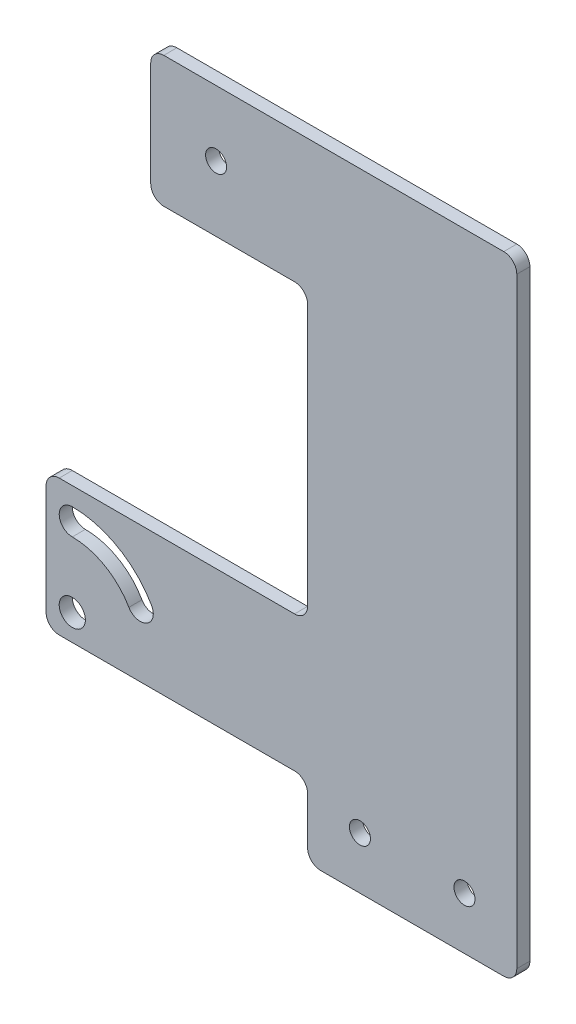
ISO-10303-21;
HEADER;
FILE_DESCRIPTION(('STEP AP214'),'2;1');
FILE_NAME('part.step','',(''),(''),'','','');
FILE_SCHEMA(('AUTOMOTIVE_DESIGN { 1 0 10303 214 1 1 1 1 }'));
ENDSEC;
DATA;
#1=APPLICATION_CONTEXT('core data for automotive mechanical design processes');
#2=APPLICATION_PROTOCOL_DEFINITION('international standard','automotive_design',2000,#1);
#3=PRODUCT_CONTEXT('',#1,'mechanical');
#4=PRODUCT('Part','Part','',(#3));
#5=PRODUCT_RELATED_PRODUCT_CATEGORY('part','',(#4));
#6=PRODUCT_DEFINITION_FORMATION('','',#4);
#7=PRODUCT_DEFINITION_CONTEXT('part definition',#1,'design');
#8=PRODUCT_DEFINITION('design','',#6,#7);
#9=PRODUCT_DEFINITION_SHAPE('','',#8);
#10=(LENGTH_UNIT() NAMED_UNIT(*) SI_UNIT(.MILLI.,.METRE.));
#11=(NAMED_UNIT(*) PLANE_ANGLE_UNIT() SI_UNIT($,.RADIAN.));
#12=(NAMED_UNIT(*) SI_UNIT($,.STERADIAN.) SOLID_ANGLE_UNIT());
#13=UNCERTAINTY_MEASURE_WITH_UNIT(LENGTH_MEASURE(1.E-05),#10,'distance_accuracy_value','');
#14=(GEOMETRIC_REPRESENTATION_CONTEXT(3) GLOBAL_UNCERTAINTY_ASSIGNED_CONTEXT((#13)) GLOBAL_UNIT_ASSIGNED_CONTEXT((#10,
#11,#12)) REPRESENTATION_CONTEXT('',''));
#15=CARTESIAN_POINT('',(0.,0.,0.));
#16=DIRECTION('',(0.,0.,1.));
#17=DIRECTION('',(1.,0.,0.));
#18=AXIS2_PLACEMENT_3D('',#15,#16,#17);
#19=CARTESIAN_POINT('',(0.,50.8,3.175));
#20=DIRECTION('',(0.,1.,0.));
#21=DIRECTION('',(0.,0.,1.));
#22=AXIS2_PLACEMENT_3D('',#19,#20,#21);
#23=PLANE('',#22);
#24=DIRECTION('',(1.,0.,0.));
#25=VECTOR('',#24,1.);
#26=CARTESIAN_POINT('',(0.,50.8,0.));
#27=LINE('',#26,#25);
#28=CARTESIAN_POINT('',(-60.325,50.8,0.));
#29=VERTEX_POINT('',#28);
#30=CARTESIAN_POINT('',(-3.175,50.8,0.));
#31=VERTEX_POINT('',#30);
#32=EDGE_CURVE('E251',#29,#31,#27,.T.);
#33=ORIENTED_EDGE('',*,*,#32,.F.);
#34=DIRECTION('',(0.,0.,-1.));
#35=VECTOR('',#34,1.);
#36=CARTESIAN_POINT('',(-60.325,50.8,3.175));
#37=LINE('',#36,#35);
#38=CARTESIAN_POINT('',(-60.325,50.8,3.175));
#39=VERTEX_POINT('',#38);
#40=EDGE_CURVE('E339',#29,#39,#37,.F.);
#41=ORIENTED_EDGE('',*,*,#40,.T.);
#42=DIRECTION('',(1.,0.,0.));
#43=VECTOR('',#42,1.);
#44=CARTESIAN_POINT('',(0.,50.8,3.175));
#45=LINE('',#44,#43);
#46=CARTESIAN_POINT('',(-3.175,50.8,3.175));
#47=VERTEX_POINT('',#46);
#48=EDGE_CURVE('E414',#39,#47,#45,.T.);
#49=ORIENTED_EDGE('',*,*,#48,.T.);
#50=DIRECTION('',(0.,0.,-1.));
#51=VECTOR('',#50,1.);
#52=CARTESIAN_POINT('',(-3.175,50.8,0.));
#53=LINE('',#52,#51);
#54=EDGE_CURVE('E336',#47,#31,#53,.T.);
#55=ORIENTED_EDGE('',*,*,#54,.T.);
#56=EDGE_LOOP('',(#33,#41,#49,#55));
#57=FACE_BOUND('',#56,.T.);
#58=ADVANCED_FACE('F39',(#57),#23,.T.);
#59=CARTESIAN_POINT('',(-57.15,43.18,3.175));
#60=DIRECTION('',(0.,0.,-1.));
#61=DIRECTION('',(-1.,0.,0.));
#62=AXIS2_PLACEMENT_3D('',#59,#60,#61);
#63=CYLINDRICAL_SURFACE('',#62,3.17500000000001);
#64=CARTESIAN_POINT('',(-57.15,43.18,0.));
#65=DIRECTION('',(0.,0.,1.));
#66=DIRECTION('',(1.,0.,0.));
#67=AXIS2_PLACEMENT_3D('',#64,#65,#66);
#68=CIRCLE('',#67,3.17500000000001);
#69=CARTESIAN_POINT('',(-57.15,46.355,0.));
#70=VERTEX_POINT('',#69);
#71=CARTESIAN_POINT('',(-57.15,40.005,0.));
#72=VERTEX_POINT('',#71);
#73=EDGE_CURVE('E207',#70,#72,#68,.T.);
#74=ORIENTED_EDGE('',*,*,#73,.F.);
#75=DIRECTION('',(0.,0.,-1.));
#76=VECTOR('',#75,1.);
#77=CARTESIAN_POINT('',(-57.15,46.355,3.175));
#78=LINE('',#77,#76);
#79=CARTESIAN_POINT('',(-57.15,46.355,3.175));
#80=VERTEX_POINT('',#79);
#81=EDGE_CURVE('E202',#80,#70,#78,.T.);
#82=ORIENTED_EDGE('',*,*,#81,.F.);
#83=CARTESIAN_POINT('',(-57.15,43.18,3.175));
#84=DIRECTION('',(0.,0.,1.));
#85=DIRECTION('',(1.,0.,0.));
#86=AXIS2_PLACEMENT_3D('',#83,#84,#85);
#87=CIRCLE('',#86,3.17500000000001);
#88=CARTESIAN_POINT('',(-57.15,40.005,3.175));
#89=VERTEX_POINT('',#88);
#90=EDGE_CURVE('E205',#80,#89,#87,.T.);
#91=ORIENTED_EDGE('',*,*,#90,.T.);
#92=DIRECTION('',(0.,0.,-1.));
#93=VECTOR('',#92,1.);
#94=CARTESIAN_POINT('',(-57.15,40.005,3.175));
#95=LINE('',#94,#93);
#96=EDGE_CURVE('E237',#89,#72,#95,.T.);
#97=ORIENTED_EDGE('',*,*,#96,.T.);
#98=EDGE_LOOP('',(#74,#82,#91,#97));
#99=FACE_BOUND('',#98,.T.);
#100=ADVANCED_FACE('F204',(#99),#63,.F.);
#101=CARTESIAN_POINT('',(-57.15,24.13,3.175));
#102=DIRECTION('',(0.,0.,-1.));
#103=DIRECTION('',(-1.,0.,0.));
#104=AXIS2_PLACEMENT_3D('',#101,#102,#103);
#105=CYLINDRICAL_SURFACE('',#104,22.225);
#106=CARTESIAN_POINT('',(-57.15,24.13,0.));
#107=DIRECTION('',(0.,0.,1.));
#108=DIRECTION('',(1.,0.,0.));
#109=AXIS2_PLACEMENT_3D('',#106,#107,#108);
#110=CIRCLE('',#109,22.225);
#111=CARTESIAN_POINT('',(-37.9025854008909,35.2425000000001,0.));
#112=VERTEX_POINT('',#111);
#113=EDGE_CURVE('E264',#112,#70,#110,.T.);
#114=ORIENTED_EDGE('',*,*,#113,.F.);
#115=DIRECTION('',(0.,0.,-1.));
#116=VECTOR('',#115,1.);
#117=CARTESIAN_POINT('',(-37.9025854008909,35.2425000000001,3.175));
#118=LINE('',#117,#116);
#119=CARTESIAN_POINT('',(-37.9025854008909,35.2425000000001,3.175));
#120=VERTEX_POINT('',#119);
#121=EDGE_CURVE('E213',#120,#112,#118,.T.);
#122=ORIENTED_EDGE('',*,*,#121,.F.);
#123=CARTESIAN_POINT('',(-57.15,24.13,3.175));
#124=DIRECTION('',(0.,0.,1.));
#125=DIRECTION('',(1.,0.,0.));
#126=AXIS2_PLACEMENT_3D('',#123,#124,#125);
#127=CIRCLE('',#126,22.225);
#128=EDGE_CURVE('E220',#120,#80,#127,.T.);
#129=ORIENTED_EDGE('',*,*,#128,.T.);
#130=ORIENTED_EDGE('',*,*,#81,.T.);
#131=EDGE_LOOP('',(#114,#122,#129,#130));
#132=FACE_BOUND('',#131,.T.);
#133=ADVANCED_FACE('F227',(#132),#105,.F.);
#134=CARTESIAN_POINT('',(-40.6522160579065,33.6550000000001,3.175));
#135=DIRECTION('',(0.,0.,-1.));
#136=DIRECTION('',(-1.,0.,0.));
#137=AXIS2_PLACEMENT_3D('',#134,#135,#136);
#138=CYLINDRICAL_SURFACE('',#137,3.175);
#139=CARTESIAN_POINT('',(-40.6522160579065,33.6550000000001,0.));
#140=DIRECTION('',(0.,0.,1.));
#141=DIRECTION('',(1.,0.,0.));
#142=AXIS2_PLACEMENT_3D('',#139,#140,#141);
#143=CIRCLE('',#142,3.175);
#144=CARTESIAN_POINT('',(-43.4018467149221,32.0675000000001,0.));
#145=VERTEX_POINT('',#144);
#146=EDGE_CURVE('E266',#145,#112,#143,.T.);
#147=ORIENTED_EDGE('',*,*,#146,.F.);
#148=DIRECTION('',(0.,0.,-1.));
#149=VECTOR('',#148,1.);
#150=CARTESIAN_POINT('',(-43.4018467149221,32.0675000000001,3.175));
#151=LINE('',#150,#149);
#152=CARTESIAN_POINT('',(-43.4018467149221,32.0675000000001,3.175));
#153=VERTEX_POINT('',#152);
#154=EDGE_CURVE('E277',#153,#145,#151,.T.);
#155=ORIENTED_EDGE('',*,*,#154,.F.);
#156=CARTESIAN_POINT('',(-40.6522160579065,33.6550000000001,3.175));
#157=DIRECTION('',(0.,0.,1.));
#158=DIRECTION('',(1.,0.,0.));
#159=AXIS2_PLACEMENT_3D('',#156,#157,#158);
#160=CIRCLE('',#159,3.175);
#161=EDGE_CURVE('E228',#153,#120,#160,.T.);
#162=ORIENTED_EDGE('',*,*,#161,.T.);
#163=ORIENTED_EDGE('',*,*,#121,.T.);
#164=EDGE_LOOP('',(#147,#155,#162,#163));
#165=FACE_BOUND('',#164,.T.);
#166=ADVANCED_FACE('F476',(#165),#138,.F.);
#167=CARTESIAN_POINT('',(0.,0.,3.175));
#168=DIRECTION('',(0.,1.,0.));
#169=DIRECTION('',(0.,0.,1.));
#170=AXIS2_PLACEMENT_3D('',#167,#168,#169);
#171=PLANE('',#170);
#172=DIRECTION('',(1.,0.,0.));
#173=VECTOR('',#172,1.);
#174=CARTESIAN_POINT('',(0.,0.,0.));
#175=LINE('',#174,#173);
#176=CARTESIAN_POINT('',(3.175,0.,0.));
#177=VERTEX_POINT('',#176);
#178=CARTESIAN_POINT('',(47.625,0.,0.));
#179=VERTEX_POINT('',#178);
#180=EDGE_CURVE('E245',#177,#179,#175,.T.);
#181=ORIENTED_EDGE('',*,*,#180,.T.);
#182=DIRECTION('',(0.,0.,-1.));
#183=VECTOR('',#182,1.);
#184=CARTESIAN_POINT('',(47.625,0.,3.175));
#185=LINE('',#184,#183);
#186=CARTESIAN_POINT('',(47.625,0.,3.175));
#187=VERTEX_POINT('',#186);
#188=EDGE_CURVE('E320',#179,#187,#185,.F.);
#189=ORIENTED_EDGE('',*,*,#188,.T.);
#190=DIRECTION('',(1.,0.,0.));
#191=VECTOR('',#190,1.);
#192=CARTESIAN_POINT('',(0.,0.,3.175));
#193=LINE('',#192,#191);
#194=CARTESIAN_POINT('',(3.175,0.,3.175));
#195=VERTEX_POINT('',#194);
#196=EDGE_CURVE('E409',#195,#187,#193,.T.);
#197=ORIENTED_EDGE('',*,*,#196,.F.);
#198=DIRECTION('',(0.,0.,-1.));
#199=VECTOR('',#198,1.);
#200=CARTESIAN_POINT('',(3.175,0.,0.));
#201=LINE('',#200,#199);
#202=EDGE_CURVE('E317',#195,#177,#201,.T.);
#203=ORIENTED_EDGE('',*,*,#202,.T.);
#204=EDGE_LOOP('',(#181,#189,#197,#203));
#205=FACE_BOUND('',#204,.T.);
#206=ADVANCED_FACE('F472',(#205),#171,.F.);
#207=CARTESIAN_POINT('',(50.8,0.,3.175));
#208=DIRECTION('',(-1.,0.,0.));
#209=DIRECTION('',(0.,0.,1.));
#210=AXIS2_PLACEMENT_3D('',#207,#208,#209);
#211=PLANE('',#210);
#212=DIRECTION('',(0.,1.,0.));
#213=VECTOR('',#212,1.);
#214=CARTESIAN_POINT('',(50.8,0.,0.));
#215=LINE('',#214,#213);
#216=CARTESIAN_POINT('',(50.8,3.175,0.));
#217=VERTEX_POINT('',#216);
#218=CARTESIAN_POINT('',(50.8,149.225,0.));
#219=VERTEX_POINT('',#218);
#220=EDGE_CURVE('E248',#217,#219,#215,.T.);
#221=ORIENTED_EDGE('',*,*,#220,.T.);
#222=DIRECTION('',(0.,0.,-1.));
#223=VECTOR('',#222,1.);
#224=CARTESIAN_POINT('',(50.8,149.225,3.175));
#225=LINE('',#224,#223);
#226=CARTESIAN_POINT('',(50.8,149.225,3.175));
#227=VERTEX_POINT('',#226);
#228=EDGE_CURVE('E301',#219,#227,#225,.F.);
#229=ORIENTED_EDGE('',*,*,#228,.T.);
#230=DIRECTION('',(0.,1.,0.));
#231=VECTOR('',#230,1.);
#232=CARTESIAN_POINT('',(50.8,0.,3.175));
#233=LINE('',#232,#231);
#234=CARTESIAN_POINT('',(50.8,3.175,3.175));
#235=VERTEX_POINT('',#234);
#236=EDGE_CURVE('E412',#235,#227,#233,.T.);
#237=ORIENTED_EDGE('',*,*,#236,.F.);
#238=DIRECTION('',(0.,0.,-1.));
#239=VECTOR('',#238,1.);
#240=CARTESIAN_POINT('',(50.8,3.175,3.175));
#241=LINE('',#240,#239);
#242=EDGE_CURVE('E298',#235,#217,#241,.T.);
#243=ORIENTED_EDGE('',*,*,#242,.T.);
#244=EDGE_LOOP('',(#221,#229,#237,#243));
#245=FACE_BOUND('',#244,.T.);
#246=ADVANCED_FACE('F469',(#245),#211,.F.);
#247=CARTESIAN_POINT('',(-63.5,0.,3.175));
#248=DIRECTION('',(1.,0.,0.));
#249=DIRECTION('',(0.,1.,0.));
#250=AXIS2_PLACEMENT_3D('',#247,#248,#249);
#251=PLANE('',#250);
#252=DIRECTION('',(0.,-1.,0.));
#253=VECTOR('',#252,1.);
#254=CARTESIAN_POINT('',(-63.5,0.,0.));
#255=LINE('',#254,#253);
#256=CARTESIAN_POINT('',(-63.5,47.625,0.));
#257=VERTEX_POINT('',#256);
#258=CARTESIAN_POINT('',(-63.5,20.955,0.));
#259=VERTEX_POINT('',#258);
#260=EDGE_CURVE('E254',#257,#259,#255,.T.);
#261=ORIENTED_EDGE('',*,*,#260,.T.);
#262=DIRECTION('',(0.,0.,-1.));
#263=VECTOR('',#262,1.);
#264=CARTESIAN_POINT('',(-63.5,20.955,3.175));
#265=LINE('',#264,#263);
#266=CARTESIAN_POINT('',(-63.5,20.955,3.175));
#267=VERTEX_POINT('',#266);
#268=EDGE_CURVE('E334',#259,#267,#265,.F.);
#269=ORIENTED_EDGE('',*,*,#268,.T.);
#270=DIRECTION('',(0.,-1.,0.));
#271=VECTOR('',#270,1.);
#272=CARTESIAN_POINT('',(-63.5,0.,3.175));
#273=LINE('',#272,#271);
#274=CARTESIAN_POINT('',(-63.5,47.625,3.175));
#275=VERTEX_POINT('',#274);
#276=EDGE_CURVE('E417',#275,#267,#273,.T.);
#277=ORIENTED_EDGE('',*,*,#276,.F.);
#278=DIRECTION('',(0.,0.,-1.));
#279=VECTOR('',#278,1.);
#280=CARTESIAN_POINT('',(-63.5,47.625,0.));
#281=LINE('',#280,#279);
#282=EDGE_CURVE('E331',#275,#257,#281,.T.);
#283=ORIENTED_EDGE('',*,*,#282,.T.);
#284=EDGE_LOOP('',(#261,#269,#277,#283));
#285=FACE_BOUND('',#284,.T.);
#286=ADVANCED_FACE('F438',(#285),#251,.F.);
#287=CARTESIAN_POINT('',(0.,17.78,3.175));
#288=DIRECTION('',(0.,1.,0.));
#289=DIRECTION('',(0.,0.,1.));
#290=AXIS2_PLACEMENT_3D('',#287,#288,#289);
#291=PLANE('',#290);
#292=DIRECTION('',(1.,0.,0.));
#293=VECTOR('',#292,1.);
#294=CARTESIAN_POINT('',(0.,17.78,0.));
#295=LINE('',#294,#293);
#296=CARTESIAN_POINT('',(-60.325,17.78,0.));
#297=VERTEX_POINT('',#296);
#298=CARTESIAN_POINT('',(-3.175,17.78,0.));
#299=VERTEX_POINT('',#298);
#300=EDGE_CURVE('E257',#297,#299,#295,.T.);
#301=ORIENTED_EDGE('',*,*,#300,.T.);
#302=DIRECTION('',(0.,0.,-1.));
#303=VECTOR('',#302,1.);
#304=CARTESIAN_POINT('',(-3.175,17.78,3.175));
#305=LINE('',#304,#303);
#306=CARTESIAN_POINT('',(-3.175,17.78,3.175));
#307=VERTEX_POINT('',#306);
#308=EDGE_CURVE('E329',#299,#307,#305,.F.);
#309=ORIENTED_EDGE('',*,*,#308,.T.);
#310=DIRECTION('',(1.,0.,0.));
#311=VECTOR('',#310,1.);
#312=CARTESIAN_POINT('',(0.,17.78,3.175));
#313=LINE('',#312,#311);
#314=CARTESIAN_POINT('',(-60.325,17.78,3.175));
#315=VERTEX_POINT('',#314);
#316=EDGE_CURVE('E420',#315,#307,#313,.T.);
#317=ORIENTED_EDGE('',*,*,#316,.F.);
#318=DIRECTION('',(0.,0.,-1.));
#319=VECTOR('',#318,1.);
#320=CARTESIAN_POINT('',(-60.325,17.78,3.175));
#321=LINE('',#320,#319);
#322=EDGE_CURVE('E326',#315,#297,#321,.T.);
#323=ORIENTED_EDGE('',*,*,#322,.T.);
#324=EDGE_LOOP('',(#301,#309,#317,#323));
#325=FACE_BOUND('',#324,.T.);
#326=ADVANCED_FACE('F429',(#325),#291,.F.);
#327=CARTESIAN_POINT('',(-57.15,24.13,3.175));
#328=DIRECTION('',(0.,0.,-1.));
#329=DIRECTION('',(-1.,0.,0.));
#330=AXIS2_PLACEMENT_3D('',#327,#328,#329);
#331=CYLINDRICAL_SURFACE('',#330,15.875);
#332=CARTESIAN_POINT('',(-57.15,24.13,0.));
#333=DIRECTION('',(0.,0.,1.));
#334=DIRECTION('',(1.,0.,0.));
#335=AXIS2_PLACEMENT_3D('',#332,#333,#334);
#336=CIRCLE('',#335,15.875);
#337=EDGE_CURVE('E269',#145,#72,#336,.T.);
#338=ORIENTED_EDGE('',*,*,#337,.T.);
#339=ORIENTED_EDGE('',*,*,#96,.F.);
#340=CARTESIAN_POINT('',(-57.15,24.13,3.175));
#341=DIRECTION('',(0.,0.,1.));
#342=DIRECTION('',(1.,0.,0.));
#343=AXIS2_PLACEMENT_3D('',#340,#341,#342);
#344=CIRCLE('',#343,15.875);
#345=EDGE_CURVE('E223',#153,#89,#344,.T.);
#346=ORIENTED_EDGE('',*,*,#345,.F.);
#347=ORIENTED_EDGE('',*,*,#154,.T.);
#348=EDGE_LOOP('',(#338,#339,#346,#347));
#349=FACE_BOUND('',#348,.T.);
#350=ADVANCED_FACE('F589',(#349),#331,.T.);
#351=CARTESIAN_POINT('',(0.,0.,3.175));
#352=DIRECTION('',(-1.,0.,0.));
#353=DIRECTION('',(0.,0.,1.));
#354=AXIS2_PLACEMENT_3D('',#351,#352,#353);
#355=PLANE('',#354);
#356=DIRECTION('',(0.,1.,0.));
#357=VECTOR('',#356,1.);
#358=CARTESIAN_POINT('',(0.,0.,0.));
#359=LINE('',#358,#357);
#360=CARTESIAN_POINT('',(0.,3.175,0.));
#361=VERTEX_POINT('',#360);
#362=CARTESIAN_POINT('',(0.,14.605,0.));
#363=VERTEX_POINT('',#362);
#364=EDGE_CURVE('E260',#361,#363,#359,.T.);
#365=ORIENTED_EDGE('',*,*,#364,.F.);
#366=DIRECTION('',(0.,0.,-1.));
#367=VECTOR('',#366,1.);
#368=CARTESIAN_POINT('',(0.,3.175,3.175));
#369=LINE('',#368,#367);
#370=CARTESIAN_POINT('',(0.,3.175,3.175));
#371=VERTEX_POINT('',#370);
#372=EDGE_CURVE('E62',#361,#371,#369,.F.);
#373=ORIENTED_EDGE('',*,*,#372,.T.);
#374=DIRECTION('',(0.,1.,0.));
#375=VECTOR('',#374,1.);
#376=CARTESIAN_POINT('',(0.,0.,3.175));
#377=LINE('',#376,#375);
#378=CARTESIAN_POINT('',(0.,14.605,3.175));
#379=VERTEX_POINT('',#378);
#380=EDGE_CURVE('E225',#371,#379,#377,.T.);
#381=ORIENTED_EDGE('',*,*,#380,.T.);
#382=DIRECTION('',(0.,0.,-1.));
#383=VECTOR('',#382,1.);
#384=CARTESIAN_POINT('',(0.,14.605,3.175));
#385=LINE('',#384,#383);
#386=EDGE_CURVE('E322',#379,#363,#385,.T.);
#387=ORIENTED_EDGE('',*,*,#386,.T.);
#388=EDGE_LOOP('',(#365,#373,#381,#387));
#389=FACE_BOUND('',#388,.T.);
#390=ADVANCED_FACE('F422',(#389),#355,.T.);
#391=CARTESIAN_POINT('',(12.7,12.7,3.175));
#392=DIRECTION('',(0.,0.,-1.));
#393=DIRECTION('',(-1.,0.,0.));
#394=AXIS2_PLACEMENT_3D('',#391,#392,#393);
#395=CYLINDRICAL_SURFACE('',#394,2.5527);
#396=CARTESIAN_POINT('',(12.7,12.7,3.175));
#397=DIRECTION('',(0.,0.,1.));
#398=DIRECTION('',(1.,0.,0.));
#399=AXIS2_PLACEMENT_3D('',#396,#397,#398);
#400=CIRCLE('',#399,2.5527);
#401=CARTESIAN_POINT('',(15.2527,12.7,3.175));
#402=VERTEX_POINT('',#401);
#403=EDGE_CURVE('E406',#402,#402,#400,.T.);
#404=ORIENTED_EDGE('',*,*,#403,.T.);
#405=EDGE_LOOP('',(#404));
#406=FACE_BOUND('',#405,.T.);
#407=CARTESIAN_POINT('',(12.7,12.7,0.));
#408=DIRECTION('',(0.,0.,1.));
#409=DIRECTION('',(1.,0.,0.));
#410=AXIS2_PLACEMENT_3D('',#407,#408,#409);
#411=CIRCLE('',#410,2.5527);
#412=CARTESIAN_POINT('',(15.2527,12.7,0.));
#413=VERTEX_POINT('',#412);
#414=EDGE_CURVE('E241',#413,#413,#411,.T.);
#415=ORIENTED_EDGE('',*,*,#414,.F.);
#416=EDGE_LOOP('',(#415));
#417=FACE_BOUND('',#416,.T.);
#418=ADVANCED_FACE('F478',(#406,#417),#395,.F.);
#419=CARTESIAN_POINT('',(38.1,12.7,3.175));
#420=DIRECTION('',(0.,0.,-1.));
#421=DIRECTION('',(-1.,0.,0.));
#422=AXIS2_PLACEMENT_3D('',#419,#420,#421);
#423=CYLINDRICAL_SURFACE('',#422,2.5527);
#424=CARTESIAN_POINT('',(38.1,12.7,3.175));
#425=DIRECTION('',(0.,0.,1.));
#426=DIRECTION('',(1.,0.,0.));
#427=AXIS2_PLACEMENT_3D('',#424,#425,#426);
#428=CIRCLE('',#427,2.5527);
#429=CARTESIAN_POINT('',(40.6527,12.7,3.175));
#430=VERTEX_POINT('',#429);
#431=EDGE_CURVE('E275',#430,#430,#428,.T.);
#432=ORIENTED_EDGE('',*,*,#431,.T.);
#433=EDGE_LOOP('',(#432));
#434=FACE_BOUND('',#433,.T.);
#435=CARTESIAN_POINT('',(38.1,12.7,0.));
#436=DIRECTION('',(0.,0.,1.));
#437=DIRECTION('',(1.,0.,0.));
#438=AXIS2_PLACEMENT_3D('',#435,#436,#437);
#439=CIRCLE('',#438,2.5527);
#440=CARTESIAN_POINT('',(40.6527,12.7,0.));
#441=VERTEX_POINT('',#440);
#442=EDGE_CURVE('E238',#441,#441,#439,.T.);
#443=ORIENTED_EDGE('',*,*,#442,.F.);
#444=EDGE_LOOP('',(#443));
#445=FACE_BOUND('',#444,.T.);
#446=ADVANCED_FACE('F481',(#434,#445),#423,.F.);
#447=CARTESIAN_POINT('',(-57.15,24.13,3.175));
#448=DIRECTION('',(0.,0.,-1.));
#449=DIRECTION('',(-1.,0.,0.));
#450=AXIS2_PLACEMENT_3D('',#447,#448,#449);
#451=CYLINDRICAL_SURFACE('',#450,3.175);
#452=CARTESIAN_POINT('',(-57.15,24.13,3.175));
#453=DIRECTION('',(0.,0.,1.));
#454=DIRECTION('',(1.,0.,0.));
#455=AXIS2_PLACEMENT_3D('',#452,#453,#454);
#456=CIRCLE('',#455,3.175);
#457=CARTESIAN_POINT('',(-53.975,24.13,3.175));
#458=VERTEX_POINT('',#457);
#459=EDGE_CURVE('E234',#458,#458,#456,.T.);
#460=ORIENTED_EDGE('',*,*,#459,.T.);
#461=EDGE_LOOP('',(#460));
#462=FACE_BOUND('',#461,.T.);
#463=CARTESIAN_POINT('',(-57.15,24.13,0.));
#464=DIRECTION('',(0.,0.,1.));
#465=DIRECTION('',(1.,0.,0.));
#466=AXIS2_PLACEMENT_3D('',#463,#464,#465);
#467=CIRCLE('',#466,3.175);
#468=CARTESIAN_POINT('',(-53.975,24.13,0.));
#469=VERTEX_POINT('',#468);
#470=EDGE_CURVE('E272',#469,#469,#467,.T.);
#471=ORIENTED_EDGE('',*,*,#470,.F.);
#472=EDGE_LOOP('',(#471));
#473=FACE_BOUND('',#472,.T.);
#474=ADVANCED_FACE('F485',(#462,#473),#451,.F.);
#475=CARTESIAN_POINT('',(0.,0.,3.175));
#476=DIRECTION('',(0.,0.,1.));
#477=DIRECTION('',(1.,0.,0.));
#478=AXIS2_PLACEMENT_3D('',#475,#476,#477);
#479=PLANE('',#478);
#480=CARTESIAN_POINT('',(-22.225,136.525,3.175));
#481=DIRECTION('',(0.,0.,1.));
#482=DIRECTION('',(1.,0.,0.));
#483=AXIS2_PLACEMENT_3D('',#480,#481,#482);
#484=CIRCLE('',#483,2.5527);
#485=CARTESIAN_POINT('',(-19.6723,136.525,3.175));
#486=VERTEX_POINT('',#485);
#487=EDGE_CURVE('E785',#486,#486,#484,.T.);
#488=ORIENTED_EDGE('',*,*,#487,.F.);
#489=EDGE_LOOP('',(#488));
#490=FACE_BOUND('',#489,.T.);
#491=ORIENTED_EDGE('',*,*,#431,.F.);
#492=EDGE_LOOP('',(#491));
#493=FACE_BOUND('',#492,.T.);
#494=ORIENTED_EDGE('',*,*,#403,.F.);
#495=EDGE_LOOP('',(#494));
#496=FACE_BOUND('',#495,.T.);
#497=ORIENTED_EDGE('',*,*,#236,.T.);
#498=CARTESIAN_POINT('',(47.625,149.225,3.175));
#499=DIRECTION('',(0.,0.,1.));
#500=DIRECTION('',(1.,0.,0.));
#501=AXIS2_PLACEMENT_3D('',#498,#499,#500);
#502=CIRCLE('',#501,3.175);
#503=CARTESIAN_POINT('',(47.625,152.4,3.175));
#504=VERTEX_POINT('',#503);
#505=EDGE_CURVE('E315',#227,#504,#502,.T.);
#506=ORIENTED_EDGE('',*,*,#505,.T.);
#507=DIRECTION('',(1.,0.,0.));
#508=VECTOR('',#507,1.);
#509=CARTESIAN_POINT('',(0.,152.4,3.175));
#510=LINE('',#509,#508);
#511=CARTESIAN_POINT('',(-34.925,152.4,3.175));
#512=VERTEX_POINT('',#511);
#513=EDGE_CURVE('E403',#512,#504,#510,.T.);
#514=ORIENTED_EDGE('',*,*,#513,.F.);
#515=CARTESIAN_POINT('',(-34.925,149.225,3.175));
#516=DIRECTION('',(0.,0.,1.));
#517=DIRECTION('',(1.,0.,0.));
#518=AXIS2_PLACEMENT_3D('',#515,#516,#517);
#519=CIRCLE('',#518,3.175);
#520=CARTESIAN_POINT('',(-38.1,149.225,3.175));
#521=VERTEX_POINT('',#520);
#522=EDGE_CURVE('E303',#512,#521,#519,.T.);
#523=ORIENTED_EDGE('',*,*,#522,.T.);
#524=DIRECTION('',(0.,-1.,0.));
#525=VECTOR('',#524,1.);
#526=CARTESIAN_POINT('',(-38.1,0.,3.175));
#527=LINE('',#526,#525);
#528=CARTESIAN_POINT('',(-38.1,123.825,3.175));
#529=VERTEX_POINT('',#528);
#530=EDGE_CURVE('E394',#521,#529,#527,.T.);
#531=ORIENTED_EDGE('',*,*,#530,.T.);
#532=CARTESIAN_POINT('',(-34.925,123.825,3.175));
#533=DIRECTION('',(0.,0.,1.));
#534=DIRECTION('',(1.,0.,0.));
#535=AXIS2_PLACEMENT_3D('',#532,#533,#534);
#536=CIRCLE('',#535,3.175);
#537=CARTESIAN_POINT('',(-34.925,120.65,3.175));
#538=VERTEX_POINT('',#537);
#539=EDGE_CURVE('E305',#529,#538,#536,.T.);
#540=ORIENTED_EDGE('',*,*,#539,.T.);
#541=DIRECTION('',(-1.,0.,0.));
#542=VECTOR('',#541,1.);
#543=CARTESIAN_POINT('',(0.,120.65,3.175));
#544=LINE('',#543,#542);
#545=CARTESIAN_POINT('',(-3.175,120.65,3.175));
#546=VERTEX_POINT('',#545);
#547=EDGE_CURVE('E389',#546,#538,#544,.T.);
#548=ORIENTED_EDGE('',*,*,#547,.F.);
#549=CARTESIAN_POINT('',(-3.175,117.475,3.175));
#550=DIRECTION('',(0.,0.,1.));
#551=DIRECTION('',(1.,0.,0.));
#552=AXIS2_PLACEMENT_3D('',#549,#550,#551);
#553=CIRCLE('',#552,3.175);
#554=CARTESIAN_POINT('',(0.,117.475,3.175));
#555=VERTEX_POINT('',#554);
#556=EDGE_CURVE('E11',#546,#555,#553,.F.);
#557=ORIENTED_EDGE('',*,*,#556,.T.);
#558=DIRECTION('',(0.,1.,0.));
#559=VECTOR('',#558,1.);
#560=CARTESIAN_POINT('',(0.,0.,3.175));
#561=LINE('',#560,#559);
#562=CARTESIAN_POINT('',(0.,53.975,3.175));
#563=VERTEX_POINT('',#562);
#564=EDGE_CURVE('E242',#563,#555,#561,.T.);
#565=ORIENTED_EDGE('',*,*,#564,.F.);
#566=CARTESIAN_POINT('',(-3.175,53.975,3.175));
#567=DIRECTION('',(0.,0.,1.));
#568=DIRECTION('',(1.,0.,0.));
#569=AXIS2_PLACEMENT_3D('',#566,#567,#568);
#570=CIRCLE('',#569,3.175);
#571=EDGE_CURVE('E361',#563,#47,#570,.F.);
#572=ORIENTED_EDGE('',*,*,#571,.T.);
#573=ORIENTED_EDGE('',*,*,#48,.F.);
#574=CARTESIAN_POINT('',(-60.325,47.625,3.175));
#575=DIRECTION('',(0.,0.,1.));
#576=DIRECTION('',(1.,0.,0.));
#577=AXIS2_PLACEMENT_3D('',#574,#575,#576);
#578=CIRCLE('',#577,3.175);
#579=EDGE_CURVE('E307',#39,#275,#578,.T.);
#580=ORIENTED_EDGE('',*,*,#579,.T.);
#581=ORIENTED_EDGE('',*,*,#276,.T.);
#582=CARTESIAN_POINT('',(-60.325,20.955,3.175));
#583=DIRECTION('',(0.,0.,1.));
#584=DIRECTION('',(1.,0.,0.));
#585=AXIS2_PLACEMENT_3D('',#582,#583,#584);
#586=CIRCLE('',#585,3.175);
#587=EDGE_CURVE('E309',#267,#315,#586,.T.);
#588=ORIENTED_EDGE('',*,*,#587,.T.);
#589=ORIENTED_EDGE('',*,*,#316,.T.);
#590=CARTESIAN_POINT('',(-3.175,14.605,3.175));
#591=DIRECTION('',(0.,0.,1.));
#592=DIRECTION('',(1.,0.,0.));
#593=AXIS2_PLACEMENT_3D('',#590,#591,#592);
#594=CIRCLE('',#593,3.175);
#595=EDGE_CURVE('E55',#307,#379,#594,.F.);
#596=ORIENTED_EDGE('',*,*,#595,.T.);
#597=ORIENTED_EDGE('',*,*,#380,.F.);
#598=CARTESIAN_POINT('',(3.175,3.175,3.175));
#599=DIRECTION('',(0.,0.,1.));
#600=DIRECTION('',(1.,0.,0.));
#601=AXIS2_PLACEMENT_3D('',#598,#599,#600);
#602=CIRCLE('',#601,3.175);
#603=EDGE_CURVE('E311',#371,#195,#602,.T.);
#604=ORIENTED_EDGE('',*,*,#603,.T.);
#605=ORIENTED_EDGE('',*,*,#196,.T.);
#606=CARTESIAN_POINT('',(47.625,3.175,3.175));
#607=DIRECTION('',(0.,0.,1.));
#608=DIRECTION('',(1.,0.,0.));
#609=AXIS2_PLACEMENT_3D('',#606,#607,#608);
#610=CIRCLE('',#609,3.175);
#611=EDGE_CURVE('E313',#187,#235,#610,.T.);
#612=ORIENTED_EDGE('',*,*,#611,.T.);
#613=EDGE_LOOP('',(#497,#506,#514,#523,#531,#540,#548,#557,#565,#572,#573,#580,#581,#588,#589,
#596,#597,#604,#605,#612));
#614=FACE_BOUND('',#613,.T.);
#615=ORIENTED_EDGE('',*,*,#90,.F.);
#616=ORIENTED_EDGE('',*,*,#128,.F.);
#617=ORIENTED_EDGE('',*,*,#161,.F.);
#618=ORIENTED_EDGE('',*,*,#345,.T.);
#619=EDGE_LOOP('',(#615,#616,#617,#618));
#620=FACE_BOUND('',#619,.T.);
#621=ORIENTED_EDGE('',*,*,#459,.F.);
#622=EDGE_LOOP('',(#621));
#623=FACE_BOUND('',#622,.T.);
#624=ADVANCED_FACE('F217',(#490,#493,#496,#614,#620,#623),#479,.T.);
#625=CARTESIAN_POINT('',(0.,0.,0.));
#626=DIRECTION('',(0.,0.,1.));
#627=DIRECTION('',(1.,0.,0.));
#628=AXIS2_PLACEMENT_3D('',#625,#626,#627);
#629=PLANE('',#628);
#630=CARTESIAN_POINT('',(-22.225,136.525,0.));
#631=DIRECTION('',(0.,0.,1.));
#632=DIRECTION('',(1.,0.,0.));
#633=AXIS2_PLACEMENT_3D('',#630,#631,#632);
#634=CIRCLE('',#633,2.5527);
#635=CARTESIAN_POINT('',(-19.6723,136.525,0.));
#636=VERTEX_POINT('',#635);
#637=EDGE_CURVE('E43',#636,#636,#634,.T.);
#638=ORIENTED_EDGE('',*,*,#637,.T.);
#639=EDGE_LOOP('',(#638));
#640=FACE_BOUND('',#639,.T.);
#641=ORIENTED_EDGE('',*,*,#442,.T.);
#642=EDGE_LOOP('',(#641));
#643=FACE_BOUND('',#642,.T.);
#644=ORIENTED_EDGE('',*,*,#414,.T.);
#645=EDGE_LOOP('',(#644));
#646=FACE_BOUND('',#645,.T.);
#647=DIRECTION('',(1.,0.,0.));
#648=VECTOR('',#647,1.);
#649=CARTESIAN_POINT('',(0.,152.4,0.));
#650=LINE('',#649,#648);
#651=CARTESIAN_POINT('',(-34.925,152.4,0.));
#652=VERTEX_POINT('',#651);
#653=CARTESIAN_POINT('',(47.625,152.4,0.));
#654=VERTEX_POINT('',#653);
#655=EDGE_CURVE('E398',#652,#654,#650,.T.);
#656=ORIENTED_EDGE('',*,*,#655,.T.);
#657=CARTESIAN_POINT('',(47.625,149.225,0.));
#658=DIRECTION('',(0.,0.,1.));
#659=DIRECTION('',(1.,0.,0.));
#660=AXIS2_PLACEMENT_3D('',#657,#658,#659);
#661=CIRCLE('',#660,3.175);
#662=EDGE_CURVE('E296',#654,#219,#661,.F.);
#663=ORIENTED_EDGE('',*,*,#662,.T.);
#664=ORIENTED_EDGE('',*,*,#220,.F.);
#665=CARTESIAN_POINT('',(47.625,3.175,0.));
#666=DIRECTION('',(0.,0.,1.));
#667=DIRECTION('',(1.,0.,0.));
#668=AXIS2_PLACEMENT_3D('',#665,#666,#667);
#669=CIRCLE('',#668,3.175);
#670=EDGE_CURVE('E294',#217,#179,#669,.F.);
#671=ORIENTED_EDGE('',*,*,#670,.T.);
#672=ORIENTED_EDGE('',*,*,#180,.F.);
#673=CARTESIAN_POINT('',(3.175,3.175,0.));
#674=DIRECTION('',(0.,0.,1.));
#675=DIRECTION('',(1.,0.,0.));
#676=AXIS2_PLACEMENT_3D('',#673,#674,#675);
#677=CIRCLE('',#676,3.175);
#678=EDGE_CURVE('E292',#177,#361,#677,.F.);
#679=ORIENTED_EDGE('',*,*,#678,.T.);
#680=ORIENTED_EDGE('',*,*,#364,.T.);
#681=CARTESIAN_POINT('',(-3.175,14.605,0.));
#682=DIRECTION('',(0.,0.,1.));
#683=DIRECTION('',(1.,0.,0.));
#684=AXIS2_PLACEMENT_3D('',#681,#682,#683);
#685=CIRCLE('',#684,3.175);
#686=EDGE_CURVE('E356',#363,#299,#685,.T.);
#687=ORIENTED_EDGE('',*,*,#686,.T.);
#688=ORIENTED_EDGE('',*,*,#300,.F.);
#689=CARTESIAN_POINT('',(-60.325,20.955,0.));
#690=DIRECTION('',(0.,0.,1.));
#691=DIRECTION('',(1.,0.,0.));
#692=AXIS2_PLACEMENT_3D('',#689,#690,#691);
#693=CIRCLE('',#692,3.175);
#694=EDGE_CURVE('E290',#297,#259,#693,.F.);
#695=ORIENTED_EDGE('',*,*,#694,.T.);
#696=ORIENTED_EDGE('',*,*,#260,.F.);
#697=CARTESIAN_POINT('',(-60.325,47.625,0.));
#698=DIRECTION('',(0.,0.,1.));
#699=DIRECTION('',(1.,0.,0.));
#700=AXIS2_PLACEMENT_3D('',#697,#698,#699);
#701=CIRCLE('',#700,3.175);
#702=EDGE_CURVE('E288',#257,#29,#701,.F.);
#703=ORIENTED_EDGE('',*,*,#702,.T.);
#704=ORIENTED_EDGE('',*,*,#32,.T.);
#705=CARTESIAN_POINT('',(-3.175,53.975,0.));
#706=DIRECTION('',(0.,0.,1.));
#707=DIRECTION('',(1.,0.,0.));
#708=AXIS2_PLACEMENT_3D('',#705,#706,#707);
#709=CIRCLE('',#708,3.175);
#710=CARTESIAN_POINT('',(0.,53.975,0.));
#711=VERTEX_POINT('',#710);
#712=EDGE_CURVE('E359',#31,#711,#709,.T.);
#713=ORIENTED_EDGE('',*,*,#712,.T.);
#714=DIRECTION('',(0.,1.,0.));
#715=VECTOR('',#714,1.);
#716=CARTESIAN_POINT('',(0.,0.,0.));
#717=LINE('',#716,#715);
#718=CARTESIAN_POINT('',(0.,117.475,0.));
#719=VERTEX_POINT('',#718);
#720=EDGE_CURVE('E372',#711,#719,#717,.T.);
#721=ORIENTED_EDGE('',*,*,#720,.T.);
#722=CARTESIAN_POINT('',(-3.175,117.475,0.));
#723=DIRECTION('',(0.,0.,1.));
#724=DIRECTION('',(1.,0.,0.));
#725=AXIS2_PLACEMENT_3D('',#722,#723,#724);
#726=CIRCLE('',#725,3.175);
#727=CARTESIAN_POINT('',(-3.175,120.65,0.));
#728=VERTEX_POINT('',#727);
#729=EDGE_CURVE('E48',#719,#728,#726,.T.);
#730=ORIENTED_EDGE('',*,*,#729,.T.);
#731=DIRECTION('',(-1.,0.,0.));
#732=VECTOR('',#731,1.);
#733=CARTESIAN_POINT('',(0.,120.65,0.));
#734=LINE('',#733,#732);
#735=CARTESIAN_POINT('',(-34.925,120.65,0.));
#736=VERTEX_POINT('',#735);
#737=EDGE_CURVE('E370',#728,#736,#734,.T.);
#738=ORIENTED_EDGE('',*,*,#737,.T.);
#739=CARTESIAN_POINT('',(-34.925,123.825,0.));
#740=DIRECTION('',(0.,0.,1.));
#741=DIRECTION('',(1.,0.,0.));
#742=AXIS2_PLACEMENT_3D('',#739,#740,#741);
#743=CIRCLE('',#742,3.175);
#744=CARTESIAN_POINT('',(-38.1,123.825,0.));
#745=VERTEX_POINT('',#744);
#746=EDGE_CURVE('E286',#736,#745,#743,.F.);
#747=ORIENTED_EDGE('',*,*,#746,.T.);
#748=DIRECTION('',(0.,-1.,0.));
#749=VECTOR('',#748,1.);
#750=CARTESIAN_POINT('',(-38.1,0.,0.));
#751=LINE('',#750,#749);
#752=CARTESIAN_POINT('',(-38.1,149.225,0.));
#753=VERTEX_POINT('',#752);
#754=EDGE_CURVE('E381',#753,#745,#751,.T.);
#755=ORIENTED_EDGE('',*,*,#754,.F.);
#756=CARTESIAN_POINT('',(-34.925,149.225,0.));
#757=DIRECTION('',(0.,0.,1.));
#758=DIRECTION('',(1.,0.,0.));
#759=AXIS2_PLACEMENT_3D('',#756,#757,#758);
#760=CIRCLE('',#759,3.175);
#761=EDGE_CURVE('E284',#753,#652,#760,.F.);
#762=ORIENTED_EDGE('',*,*,#761,.T.);
#763=EDGE_LOOP('',(#656,#663,#664,#671,#672,#679,#680,#687,#688,#695,#696,#703,#704,#713,#721,
#730,#738,#747,#755,#762));
#764=FACE_BOUND('',#763,.T.);
#765=ORIENTED_EDGE('',*,*,#73,.T.);
#766=ORIENTED_EDGE('',*,*,#337,.F.);
#767=ORIENTED_EDGE('',*,*,#146,.T.);
#768=ORIENTED_EDGE('',*,*,#113,.T.);
#769=EDGE_LOOP('',(#765,#766,#767,#768));
#770=FACE_BOUND('',#769,.T.);
#771=ORIENTED_EDGE('',*,*,#470,.T.);
#772=EDGE_LOOP('',(#771));
#773=FACE_BOUND('',#772,.T.);
#774=ADVANCED_FACE('F368',(#640,#643,#646,#764,#770,#773),#629,.F.);
#775=CARTESIAN_POINT('',(0.,152.4,3.175));
#776=DIRECTION('',(0.,1.,0.));
#777=DIRECTION('',(0.,0.,1.));
#778=AXIS2_PLACEMENT_3D('',#775,#776,#777);
#779=PLANE('',#778);
#780=ORIENTED_EDGE('',*,*,#513,.T.);
#781=DIRECTION('',(0.,0.,-1.));
#782=VECTOR('',#781,1.);
#783=CARTESIAN_POINT('',(47.625,152.4,0.));
#784=LINE('',#783,#782);
#785=EDGE_CURVE('E281',#504,#654,#784,.T.);
#786=ORIENTED_EDGE('',*,*,#785,.T.);
#787=ORIENTED_EDGE('',*,*,#655,.F.);
#788=DIRECTION('',(0.,0.,-1.));
#789=VECTOR('',#788,1.);
#790=CARTESIAN_POINT('',(-34.925,152.4,3.175));
#791=LINE('',#790,#789);
#792=EDGE_CURVE('E212',#652,#512,#791,.F.);
#793=ORIENTED_EDGE('',*,*,#792,.T.);
#794=EDGE_LOOP('',(#780,#786,#787,#793));
#795=FACE_BOUND('',#794,.T.);
#796=ADVANCED_FACE('F560',(#795),#779,.T.);
#797=CARTESIAN_POINT('',(-38.1,0.,3.175));
#798=DIRECTION('',(1.,0.,0.));
#799=DIRECTION('',(0.,1.,0.));
#800=AXIS2_PLACEMENT_3D('',#797,#798,#799);
#801=PLANE('',#800);
#802=ORIENTED_EDGE('',*,*,#754,.T.);
#803=DIRECTION('',(0.,0.,-1.));
#804=VECTOR('',#803,1.);
#805=CARTESIAN_POINT('',(-38.1,123.825,3.175));
#806=LINE('',#805,#804);
#807=EDGE_CURVE('E354',#745,#529,#806,.F.);
#808=ORIENTED_EDGE('',*,*,#807,.T.);
#809=ORIENTED_EDGE('',*,*,#530,.F.);
#810=DIRECTION('',(0.,0.,-1.));
#811=VECTOR('',#810,1.);
#812=CARTESIAN_POINT('',(-38.1,149.225,0.));
#813=LINE('',#812,#811);
#814=EDGE_CURVE('E351',#521,#753,#813,.T.);
#815=ORIENTED_EDGE('',*,*,#814,.T.);
#816=EDGE_LOOP('',(#802,#808,#809,#815));
#817=FACE_BOUND('',#816,.T.);
#818=ADVANCED_FACE('F581',(#817),#801,.F.);
#819=CARTESIAN_POINT('',(0.,120.65,3.175));
#820=DIRECTION('',(0.,-1.,0.));
#821=DIRECTION('',(1.,0.,0.));
#822=AXIS2_PLACEMENT_3D('',#819,#820,#821);
#823=PLANE('',#822);
#824=ORIENTED_EDGE('',*,*,#737,.F.);
#825=DIRECTION('',(0.,0.,-1.));
#826=VECTOR('',#825,1.);
#827=CARTESIAN_POINT('',(-3.175,120.65,3.175));
#828=LINE('',#827,#826);
#829=EDGE_CURVE('E349',#728,#546,#828,.F.);
#830=ORIENTED_EDGE('',*,*,#829,.T.);
#831=ORIENTED_EDGE('',*,*,#547,.T.);
#832=DIRECTION('',(0.,0.,-1.));
#833=VECTOR('',#832,1.);
#834=CARTESIAN_POINT('',(-34.925,120.65,0.));
#835=LINE('',#834,#833);
#836=EDGE_CURVE('E346',#538,#736,#835,.T.);
#837=ORIENTED_EDGE('',*,*,#836,.T.);
#838=EDGE_LOOP('',(#824,#830,#831,#837));
#839=FACE_BOUND('',#838,.T.);
#840=ADVANCED_FACE('F377',(#839),#823,.T.);
#841=CARTESIAN_POINT('',(0.,0.,3.175));
#842=DIRECTION('',(-1.,0.,0.));
#843=DIRECTION('',(0.,-1.,0.));
#844=AXIS2_PLACEMENT_3D('',#841,#842,#843);
#845=PLANE('',#844);
#846=ORIENTED_EDGE('',*,*,#720,.F.);
#847=DIRECTION('',(0.,0.,-1.));
#848=VECTOR('',#847,1.);
#849=CARTESIAN_POINT('',(0.,53.975,3.175));
#850=LINE('',#849,#848);
#851=EDGE_CURVE('E344',#711,#563,#850,.F.);
#852=ORIENTED_EDGE('',*,*,#851,.T.);
#853=ORIENTED_EDGE('',*,*,#564,.T.);
#854=DIRECTION('',(0.,0.,-1.));
#855=VECTOR('',#854,1.);
#856=CARTESIAN_POINT('',(0.,117.475,0.));
#857=LINE('',#856,#855);
#858=EDGE_CURVE('E341',#555,#719,#857,.T.);
#859=ORIENTED_EDGE('',*,*,#858,.T.);
#860=EDGE_LOOP('',(#846,#852,#853,#859));
#861=FACE_BOUND('',#860,.T.);
#862=ADVANCED_FACE('F391',(#861),#845,.T.);
#863=CARTESIAN_POINT('',(47.625,149.225,3.175));
#864=DIRECTION('',(0.,0.,1.));
#865=DIRECTION('',(1.,0.,0.));
#866=AXIS2_PLACEMENT_3D('',#863,#864,#865);
#867=CYLINDRICAL_SURFACE('',#866,3.175);
#868=ORIENTED_EDGE('',*,*,#505,.F.);
#869=ORIENTED_EDGE('',*,*,#228,.F.);
#870=ORIENTED_EDGE('',*,*,#662,.F.);
#871=ORIENTED_EDGE('',*,*,#785,.F.);
#872=EDGE_LOOP('',(#868,#869,#870,#871));
#873=FACE_BOUND('',#872,.T.);
#874=ADVANCED_FACE('F487',(#873),#867,.T.);
#875=CARTESIAN_POINT('',(47.625,3.175,3.175));
#876=DIRECTION('',(0.,0.,-1.));
#877=DIRECTION('',(-1.,0.,0.));
#878=AXIS2_PLACEMENT_3D('',#875,#876,#877);
#879=CYLINDRICAL_SURFACE('',#878,3.175);
#880=ORIENTED_EDGE('',*,*,#611,.F.);
#881=ORIENTED_EDGE('',*,*,#188,.F.);
#882=ORIENTED_EDGE('',*,*,#670,.F.);
#883=ORIENTED_EDGE('',*,*,#242,.F.);
#884=EDGE_LOOP('',(#880,#881,#882,#883));
#885=FACE_BOUND('',#884,.T.);
#886=ADVANCED_FACE('F490',(#885),#879,.T.);
#887=CARTESIAN_POINT('',(3.175,3.175,3.175));
#888=DIRECTION('',(0.,0.,1.));
#889=DIRECTION('',(1.,0.,0.));
#890=AXIS2_PLACEMENT_3D('',#887,#888,#889);
#891=CYLINDRICAL_SURFACE('',#890,3.175);
#892=ORIENTED_EDGE('',*,*,#603,.F.);
#893=ORIENTED_EDGE('',*,*,#372,.F.);
#894=ORIENTED_EDGE('',*,*,#678,.F.);
#895=ORIENTED_EDGE('',*,*,#202,.F.);
#896=EDGE_LOOP('',(#892,#893,#894,#895));
#897=FACE_BOUND('',#896,.T.);
#898=ADVANCED_FACE('F494',(#897),#891,.T.);
#899=CARTESIAN_POINT('',(-3.175,14.605,3.175));
#900=DIRECTION('',(0.,0.,-1.));
#901=DIRECTION('',(-1.,0.,0.));
#902=AXIS2_PLACEMENT_3D('',#899,#900,#901);
#903=CYLINDRICAL_SURFACE('',#902,3.175);
#904=ORIENTED_EDGE('',*,*,#595,.F.);
#905=ORIENTED_EDGE('',*,*,#308,.F.);
#906=ORIENTED_EDGE('',*,*,#686,.F.);
#907=ORIENTED_EDGE('',*,*,#386,.F.);
#908=EDGE_LOOP('',(#904,#905,#906,#907));
#909=FACE_BOUND('',#908,.T.);
#910=ADVANCED_FACE('F425',(#909),#903,.F.);
#911=CARTESIAN_POINT('',(-60.325,20.955,3.175));
#912=DIRECTION('',(0.,0.,-1.));
#913=DIRECTION('',(-1.,0.,0.));
#914=AXIS2_PLACEMENT_3D('',#911,#912,#913);
#915=CYLINDRICAL_SURFACE('',#914,3.175);
#916=ORIENTED_EDGE('',*,*,#587,.F.);
#917=ORIENTED_EDGE('',*,*,#268,.F.);
#918=ORIENTED_EDGE('',*,*,#694,.F.);
#919=ORIENTED_EDGE('',*,*,#322,.F.);
#920=EDGE_LOOP('',(#916,#917,#918,#919));
#921=FACE_BOUND('',#920,.T.);
#922=ADVANCED_FACE('F434',(#921),#915,.T.);
#923=CARTESIAN_POINT('',(-60.325,47.625,3.175));
#924=DIRECTION('',(0.,0.,1.));
#925=DIRECTION('',(1.,0.,0.));
#926=AXIS2_PLACEMENT_3D('',#923,#924,#925);
#927=CYLINDRICAL_SURFACE('',#926,3.175);
#928=ORIENTED_EDGE('',*,*,#579,.F.);
#929=ORIENTED_EDGE('',*,*,#40,.F.);
#930=ORIENTED_EDGE('',*,*,#702,.F.);
#931=ORIENTED_EDGE('',*,*,#282,.F.);
#932=EDGE_LOOP('',(#928,#929,#930,#931));
#933=FACE_BOUND('',#932,.T.);
#934=ADVANCED_FACE('F443',(#933),#927,.T.);
#935=CARTESIAN_POINT('',(-3.175,53.975,3.175));
#936=DIRECTION('',(0.,0.,1.));
#937=DIRECTION('',(1.,0.,0.));
#938=AXIS2_PLACEMENT_3D('',#935,#936,#937);
#939=CYLINDRICAL_SURFACE('',#938,3.175);
#940=ORIENTED_EDGE('',*,*,#571,.F.);
#941=ORIENTED_EDGE('',*,*,#851,.F.);
#942=ORIENTED_EDGE('',*,*,#712,.F.);
#943=ORIENTED_EDGE('',*,*,#54,.F.);
#944=EDGE_LOOP('',(#940,#941,#942,#943));
#945=FACE_BOUND('',#944,.T.);
#946=ADVANCED_FACE('F450',(#945),#939,.F.);
#947=CARTESIAN_POINT('',(-3.175,117.475,3.175));
#948=DIRECTION('',(0.,0.,1.));
#949=DIRECTION('',(1.,0.,0.));
#950=AXIS2_PLACEMENT_3D('',#947,#948,#949);
#951=CYLINDRICAL_SURFACE('',#950,3.175);
#952=ORIENTED_EDGE('',*,*,#556,.F.);
#953=ORIENTED_EDGE('',*,*,#829,.F.);
#954=ORIENTED_EDGE('',*,*,#729,.F.);
#955=ORIENTED_EDGE('',*,*,#858,.F.);
#956=EDGE_LOOP('',(#952,#953,#954,#955));
#957=FACE_BOUND('',#956,.T.);
#958=ADVANCED_FACE('F384',(#957),#951,.F.);
#959=CARTESIAN_POINT('',(-34.925,123.825,3.175));
#960=DIRECTION('',(0.,0.,1.));
#961=DIRECTION('',(1.,0.,0.));
#962=AXIS2_PLACEMENT_3D('',#959,#960,#961);
#963=CYLINDRICAL_SURFACE('',#962,3.175);
#964=ORIENTED_EDGE('',*,*,#539,.F.);
#965=ORIENTED_EDGE('',*,*,#807,.F.);
#966=ORIENTED_EDGE('',*,*,#746,.F.);
#967=ORIENTED_EDGE('',*,*,#836,.F.);
#968=EDGE_LOOP('',(#964,#965,#966,#967));
#969=FACE_BOUND('',#968,.T.);
#970=ADVANCED_FACE('F457',(#969),#963,.T.);
#971=CARTESIAN_POINT('',(-34.925,149.225,3.175));
#972=DIRECTION('',(0.,0.,1.));
#973=DIRECTION('',(1.,0.,0.));
#974=AXIS2_PLACEMENT_3D('',#971,#972,#973);
#975=CYLINDRICAL_SURFACE('',#974,3.175);
#976=ORIENTED_EDGE('',*,*,#522,.F.);
#977=ORIENTED_EDGE('',*,*,#792,.F.);
#978=ORIENTED_EDGE('',*,*,#761,.F.);
#979=ORIENTED_EDGE('',*,*,#814,.F.);
#980=EDGE_LOOP('',(#976,#977,#978,#979));
#981=FACE_BOUND('',#980,.T.);
#982=ADVANCED_FACE('F41',(#981),#975,.T.);
#983=CARTESIAN_POINT('',(-22.225,136.525,-22.225));
#984=DIRECTION('',(0.,0.,1.));
#985=DIRECTION('',(1.,0.,0.));
#986=AXIS2_PLACEMENT_3D('',#983,#984,#985);
#987=CYLINDRICAL_SURFACE('',#986,2.5527);
#988=ORIENTED_EDGE('',*,*,#487,.T.);
#989=EDGE_LOOP('',(#988));
#990=FACE_BOUND('',#989,.T.);
#991=ORIENTED_EDGE('',*,*,#637,.F.);
#992=EDGE_LOOP('',(#991));
#993=FACE_BOUND('',#992,.T.);
#994=ADVANCED_FACE('F537',(#990,#993),#987,.F.);
#995=CLOSED_SHELL('',(#58,#100,#133,#166,#206,#246,#286,#326,#350,#390,#418,#446,#474,#624,#774,
#796,#818,#840,#862,#874,#886,#898,#910,#922,#934,#946,#958,#970,#982,#994));
#996=MANIFOLD_SOLID_BREP('B2',#995);
#997=ADVANCED_BREP_SHAPE_REPRESENTATION('',(#18,#996),#14);
#998=SHAPE_DEFINITION_REPRESENTATION(#9,#997);
ENDSEC;
END-ISO-10303-21;
